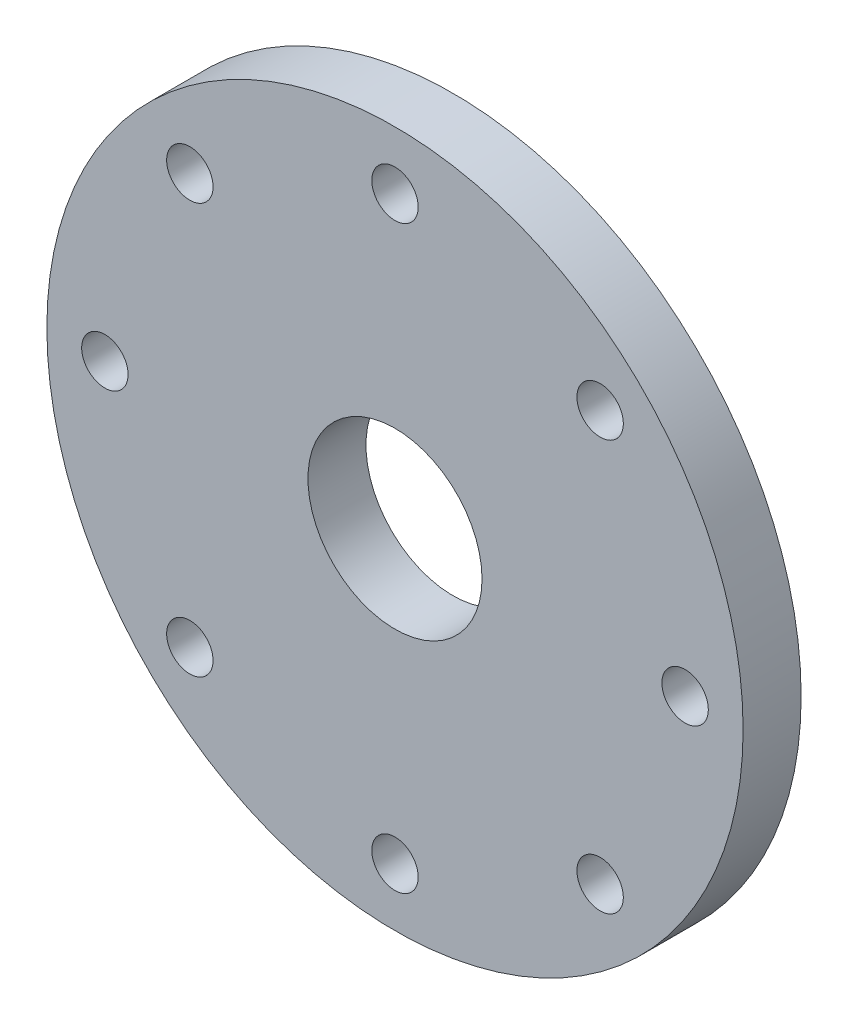
ISO-10303-21;
HEADER;
FILE_DESCRIPTION(('STEP AP214'),'2;1');
FILE_NAME('part.step','',(''),(''),'','','');
FILE_SCHEMA(('AUTOMOTIVE_DESIGN { 1 0 10303 214 1 1 1 1 }'));
ENDSEC;
DATA;
#1=APPLICATION_CONTEXT('core data for automotive mechanical design processes');
#2=APPLICATION_PROTOCOL_DEFINITION('international standard','automotive_design',2000,#1);
#3=PRODUCT_CONTEXT('',#1,'mechanical');
#4=PRODUCT('Part','Part','',(#3));
#5=PRODUCT_RELATED_PRODUCT_CATEGORY('part','',(#4));
#6=PRODUCT_DEFINITION_FORMATION('','',#4);
#7=PRODUCT_DEFINITION_CONTEXT('part definition',#1,'design');
#8=PRODUCT_DEFINITION('design','',#6,#7);
#9=PRODUCT_DEFINITION_SHAPE('','',#8);
#10=(LENGTH_UNIT() NAMED_UNIT(*) SI_UNIT(.MILLI.,.METRE.));
#11=(NAMED_UNIT(*) PLANE_ANGLE_UNIT() SI_UNIT($,.RADIAN.));
#12=(NAMED_UNIT(*) SI_UNIT($,.STERADIAN.) SOLID_ANGLE_UNIT());
#13=UNCERTAINTY_MEASURE_WITH_UNIT(LENGTH_MEASURE(1.E-05),#10,'distance_accuracy_value','');
#14=(GEOMETRIC_REPRESENTATION_CONTEXT(3) GLOBAL_UNCERTAINTY_ASSIGNED_CONTEXT((#13)) GLOBAL_UNIT_ASSIGNED_CONTEXT((#10,
#11,#12)) REPRESENTATION_CONTEXT('',''));
#15=CARTESIAN_POINT('',(0.,0.,0.));
#16=DIRECTION('',(0.,0.,1.));
#17=DIRECTION('',(1.,0.,0.));
#18=AXIS2_PLACEMENT_3D('',#15,#16,#17);
#19=CARTESIAN_POINT('',(0.,0.,3.175));
#20=DIRECTION('',(0.,0.,1.));
#21=DIRECTION('',(1.,0.,0.));
#22=AXIS2_PLACEMENT_3D('',#19,#20,#21);
#23=PLANE('',#22);
#24=CARTESIAN_POINT('',(-15.875,1.66281895072834E-13,3.175));
#25=DIRECTION('',(0.,0.,1.));
#26=DIRECTION('',(1.,0.,0.));
#27=AXIS2_PLACEMENT_3D('',#24,#25,#26);
#28=CIRCLE('',#27,1.27);
#29=CARTESIAN_POINT('',(-14.605,1.66281895072834E-13,3.175));
#30=VERTEX_POINT('',#29);
#31=EDGE_CURVE('E81',#30,#30,#28,.T.);
#32=ORIENTED_EDGE('',*,*,#31,.F.);
#33=EDGE_LOOP('',(#32));
#34=FACE_BOUND('',#33,.T.);
#35=CARTESIAN_POINT('',(-1.10854596715223E-13,-15.875,3.175));
#36=DIRECTION('',(0.,0.,1.));
#37=DIRECTION('',(1.,0.,0.));
#38=AXIS2_PLACEMENT_3D('',#35,#36,#37);
#39=CIRCLE('',#38,1.27);
#40=CARTESIAN_POINT('',(1.26999999999989,-15.875,3.175));
#41=VERTEX_POINT('',#40);
#42=EDGE_CURVE('E69',#41,#41,#39,.T.);
#43=ORIENTED_EDGE('',*,*,#42,.F.);
#44=EDGE_LOOP('',(#43));
#45=FACE_BOUND('',#44,.T.);
#46=CARTESIAN_POINT('',(15.875,0.,3.175));
#47=DIRECTION('',(0.,0.,1.));
#48=DIRECTION('',(1.,0.,0.));
#49=AXIS2_PLACEMENT_3D('',#46,#47,#48);
#50=CIRCLE('',#49,1.27);
#51=CARTESIAN_POINT('',(17.145,0.,3.175));
#52=VERTEX_POINT('',#51);
#53=EDGE_CURVE('E57',#52,#52,#50,.T.);
#54=ORIENTED_EDGE('',*,*,#53,.F.);
#55=EDGE_LOOP('',(#54));
#56=FACE_BOUND('',#55,.T.);
#57=CARTESIAN_POINT('',(11.2253201513365,11.2253201513364,3.175));
#58=DIRECTION('',(0.,0.,1.));
#59=DIRECTION('',(1.,0.,0.));
#60=AXIS2_PLACEMENT_3D('',#57,#58,#59);
#61=CIRCLE('',#60,1.27);
#62=CARTESIAN_POINT('',(12.4953201513365,11.2253201513364,3.175));
#63=VERTEX_POINT('',#62);
#64=EDGE_CURVE('E45',#63,#63,#61,.T.);
#65=ORIENTED_EDGE('',*,*,#64,.F.);
#66=EDGE_LOOP('',(#65));
#67=FACE_BOUND('',#66,.T.);
#68=CARTESIAN_POINT('',(0.,0.,3.175));
#69=DIRECTION('',(0.,0.,1.));
#70=DIRECTION('',(1.,0.,0.));
#71=AXIS2_PLACEMENT_3D('',#68,#69,#70);
#72=CIRCLE('',#71,19.05);
#73=CARTESIAN_POINT('',(19.05,0.,3.175));
#74=VERTEX_POINT('',#73);
#75=EDGE_CURVE('E10',#74,#74,#72,.T.);
#76=ORIENTED_EDGE('',*,*,#75,.T.);
#77=EDGE_LOOP('',(#76));
#78=FACE_BOUND('',#77,.T.);
#79=CARTESIAN_POINT('',(0.,15.875,3.175));
#80=DIRECTION('',(0.,0.,1.));
#81=DIRECTION('',(1.,0.,0.));
#82=AXIS2_PLACEMENT_3D('',#79,#80,#81);
#83=CIRCLE('',#82,1.27);
#84=CARTESIAN_POINT('',(1.27,15.875,3.175));
#85=VERTEX_POINT('',#84);
#86=EDGE_CURVE('E40',#85,#85,#83,.T.);
#87=ORIENTED_EDGE('',*,*,#86,.F.);
#88=EDGE_LOOP('',(#87));
#89=FACE_BOUND('',#88,.T.);
#90=CARTESIAN_POINT('',(0.,0.,3.175));
#91=DIRECTION('',(0.,0.,1.));
#92=DIRECTION('',(1.,0.,0.));
#93=AXIS2_PLACEMENT_3D('',#90,#91,#92);
#94=CIRCLE('',#93,4.7625);
#95=CARTESIAN_POINT('',(4.7625,0.,3.175));
#96=VERTEX_POINT('',#95);
#97=EDGE_CURVE('E51',#96,#96,#94,.T.);
#98=ORIENTED_EDGE('',*,*,#97,.F.);
#99=EDGE_LOOP('',(#98));
#100=FACE_BOUND('',#99,.T.);
#101=CARTESIAN_POINT('',(11.2253201513364,-11.2253201513365,3.175));
#102=DIRECTION('',(0.,0.,1.));
#103=DIRECTION('',(1.,0.,0.));
#104=AXIS2_PLACEMENT_3D('',#101,#102,#103);
#105=CIRCLE('',#104,1.27);
#106=CARTESIAN_POINT('',(12.4953201513364,-11.2253201513365,3.175));
#107=VERTEX_POINT('',#106);
#108=EDGE_CURVE('E63',#107,#107,#105,.T.);
#109=ORIENTED_EDGE('',*,*,#108,.F.);
#110=EDGE_LOOP('',(#109));
#111=FACE_BOUND('',#110,.T.);
#112=CARTESIAN_POINT('',(-11.2253201513365,-11.2253201513363,3.175));
#113=DIRECTION('',(0.,0.,1.));
#114=DIRECTION('',(1.,0.,0.));
#115=AXIS2_PLACEMENT_3D('',#112,#113,#114);
#116=CIRCLE('',#115,1.27);
#117=CARTESIAN_POINT('',(-9.95532015133654,-11.2253201513363,3.175));
#118=VERTEX_POINT('',#117);
#119=EDGE_CURVE('E75',#118,#118,#116,.T.);
#120=ORIENTED_EDGE('',*,*,#119,.F.);
#121=EDGE_LOOP('',(#120));
#122=FACE_BOUND('',#121,.T.);
#123=CARTESIAN_POINT('',(-11.2253201513363,11.2253201513366,3.175));
#124=DIRECTION('',(0.,0.,1.));
#125=DIRECTION('',(1.,0.,0.));
#126=AXIS2_PLACEMENT_3D('',#123,#124,#125);
#127=CIRCLE('',#126,1.27);
#128=CARTESIAN_POINT('',(-9.95532015133631,11.2253201513366,3.175));
#129=VERTEX_POINT('',#128);
#130=EDGE_CURVE('E87',#129,#129,#127,.T.);
#131=ORIENTED_EDGE('',*,*,#130,.F.);
#132=EDGE_LOOP('',(#131));
#133=FACE_BOUND('',#132,.T.);
#134=ADVANCED_FACE('F29',(#34,#45,#56,#67,#78,#89,#100,#111,#122,#133),#23,.T.);
#135=CARTESIAN_POINT('',(0.,0.,0.));
#136=DIRECTION('',(0.,0.,1.));
#137=DIRECTION('',(1.,0.,0.));
#138=AXIS2_PLACEMENT_3D('',#135,#136,#137);
#139=PLANE('',#138);
#140=CARTESIAN_POINT('',(-15.875,1.66281895072834E-13,0.));
#141=DIRECTION('',(0.,0.,1.));
#142=DIRECTION('',(1.,0.,0.));
#143=AXIS2_PLACEMENT_3D('',#140,#141,#142);
#144=CIRCLE('',#143,1.27);
#145=CARTESIAN_POINT('',(-14.605,1.66281895072834E-13,0.));
#146=VERTEX_POINT('',#145);
#147=EDGE_CURVE('E84',#146,#146,#144,.T.);
#148=ORIENTED_EDGE('',*,*,#147,.T.);
#149=EDGE_LOOP('',(#148));
#150=FACE_BOUND('',#149,.T.);
#151=CARTESIAN_POINT('',(-1.10854596715223E-13,-15.875,0.));
#152=DIRECTION('',(0.,0.,1.));
#153=DIRECTION('',(1.,0.,0.));
#154=AXIS2_PLACEMENT_3D('',#151,#152,#153);
#155=CIRCLE('',#154,1.27);
#156=CARTESIAN_POINT('',(1.26999999999989,-15.875,0.));
#157=VERTEX_POINT('',#156);
#158=EDGE_CURVE('E72',#157,#157,#155,.T.);
#159=ORIENTED_EDGE('',*,*,#158,.T.);
#160=EDGE_LOOP('',(#159));
#161=FACE_BOUND('',#160,.T.);
#162=CARTESIAN_POINT('',(15.875,0.,0.));
#163=DIRECTION('',(0.,0.,1.));
#164=DIRECTION('',(1.,0.,0.));
#165=AXIS2_PLACEMENT_3D('',#162,#163,#164);
#166=CIRCLE('',#165,1.27);
#167=CARTESIAN_POINT('',(17.145,0.,0.));
#168=VERTEX_POINT('',#167);
#169=EDGE_CURVE('E60',#168,#168,#166,.T.);
#170=ORIENTED_EDGE('',*,*,#169,.T.);
#171=EDGE_LOOP('',(#170));
#172=FACE_BOUND('',#171,.T.);
#173=CARTESIAN_POINT('',(11.2253201513365,11.2253201513364,0.));
#174=DIRECTION('',(0.,0.,1.));
#175=DIRECTION('',(1.,0.,0.));
#176=AXIS2_PLACEMENT_3D('',#173,#174,#175);
#177=CIRCLE('',#176,1.27);
#178=CARTESIAN_POINT('',(12.4953201513365,11.2253201513364,0.));
#179=VERTEX_POINT('',#178);
#180=EDGE_CURVE('E48',#179,#179,#177,.T.);
#181=ORIENTED_EDGE('',*,*,#180,.T.);
#182=EDGE_LOOP('',(#181));
#183=FACE_BOUND('',#182,.T.);
#184=CARTESIAN_POINT('',(0.,0.,0.));
#185=DIRECTION('',(0.,0.,1.));
#186=DIRECTION('',(1.,0.,0.));
#187=AXIS2_PLACEMENT_3D('',#184,#185,#186);
#188=CIRCLE('',#187,19.05);
#189=CARTESIAN_POINT('',(19.05,0.,0.));
#190=VERTEX_POINT('',#189);
#191=EDGE_CURVE('E33',#190,#190,#188,.T.);
#192=ORIENTED_EDGE('',*,*,#191,.F.);
#193=EDGE_LOOP('',(#192));
#194=FACE_BOUND('',#193,.T.);
#195=CARTESIAN_POINT('',(0.,15.875,0.));
#196=DIRECTION('',(0.,0.,1.));
#197=DIRECTION('',(1.,0.,0.));
#198=AXIS2_PLACEMENT_3D('',#195,#196,#197);
#199=CIRCLE('',#198,1.27);
#200=CARTESIAN_POINT('',(1.27,15.875,0.));
#201=VERTEX_POINT('',#200);
#202=EDGE_CURVE('E42',#201,#201,#199,.T.);
#203=ORIENTED_EDGE('',*,*,#202,.T.);
#204=EDGE_LOOP('',(#203));
#205=FACE_BOUND('',#204,.T.);
#206=CARTESIAN_POINT('',(0.,0.,0.));
#207=DIRECTION('',(0.,0.,1.));
#208=DIRECTION('',(1.,0.,0.));
#209=AXIS2_PLACEMENT_3D('',#206,#207,#208);
#210=CIRCLE('',#209,4.7625);
#211=CARTESIAN_POINT('',(4.7625,0.,0.));
#212=VERTEX_POINT('',#211);
#213=EDGE_CURVE('E54',#212,#212,#210,.T.);
#214=ORIENTED_EDGE('',*,*,#213,.T.);
#215=EDGE_LOOP('',(#214));
#216=FACE_BOUND('',#215,.T.);
#217=CARTESIAN_POINT('',(11.2253201513364,-11.2253201513365,0.));
#218=DIRECTION('',(0.,0.,1.));
#219=DIRECTION('',(1.,0.,0.));
#220=AXIS2_PLACEMENT_3D('',#217,#218,#219);
#221=CIRCLE('',#220,1.27);
#222=CARTESIAN_POINT('',(12.4953201513364,-11.2253201513365,0.));
#223=VERTEX_POINT('',#222);
#224=EDGE_CURVE('E66',#223,#223,#221,.T.);
#225=ORIENTED_EDGE('',*,*,#224,.T.);
#226=EDGE_LOOP('',(#225));
#227=FACE_BOUND('',#226,.T.);
#228=CARTESIAN_POINT('',(-11.2253201513365,-11.2253201513363,0.));
#229=DIRECTION('',(0.,0.,1.));
#230=DIRECTION('',(1.,0.,0.));
#231=AXIS2_PLACEMENT_3D('',#228,#229,#230);
#232=CIRCLE('',#231,1.27);
#233=CARTESIAN_POINT('',(-9.95532015133654,-11.2253201513363,0.));
#234=VERTEX_POINT('',#233);
#235=EDGE_CURVE('E78',#234,#234,#232,.T.);
#236=ORIENTED_EDGE('',*,*,#235,.T.);
#237=EDGE_LOOP('',(#236));
#238=FACE_BOUND('',#237,.T.);
#239=CARTESIAN_POINT('',(-11.2253201513363,11.2253201513366,0.));
#240=DIRECTION('',(0.,0.,1.));
#241=DIRECTION('',(1.,0.,0.));
#242=AXIS2_PLACEMENT_3D('',#239,#240,#241);
#243=CIRCLE('',#242,1.27);
#244=CARTESIAN_POINT('',(-9.95532015133631,11.2253201513366,0.));
#245=VERTEX_POINT('',#244);
#246=EDGE_CURVE('E90',#245,#245,#243,.T.);
#247=ORIENTED_EDGE('',*,*,#246,.T.);
#248=EDGE_LOOP('',(#247));
#249=FACE_BOUND('',#248,.T.);
#250=ADVANCED_FACE('F100',(#150,#161,#172,#183,#194,#205,#216,#227,#238,#249),#139,.F.);
#251=CARTESIAN_POINT('',(0.,0.,3.175));
#252=DIRECTION('',(0.,0.,-1.));
#253=DIRECTION('',(-1.,0.,0.));
#254=AXIS2_PLACEMENT_3D('',#251,#252,#253);
#255=CYLINDRICAL_SURFACE('',#254,19.05);
#256=ORIENTED_EDGE('',*,*,#75,.F.);
#257=EDGE_LOOP('',(#256));
#258=FACE_BOUND('',#257,.T.);
#259=ORIENTED_EDGE('',*,*,#191,.T.);
#260=EDGE_LOOP('',(#259));
#261=FACE_BOUND('',#260,.T.);
#262=ADVANCED_FACE('F31',(#258,#261),#255,.T.);
#263=CARTESIAN_POINT('',(0.,15.875,3.175));
#264=DIRECTION('',(0.,0.,-1.));
#265=DIRECTION('',(-1.,0.,0.));
#266=AXIS2_PLACEMENT_3D('',#263,#264,#265);
#267=CYLINDRICAL_SURFACE('',#266,1.27);
#268=ORIENTED_EDGE('',*,*,#86,.T.);
#269=EDGE_LOOP('',(#268));
#270=FACE_BOUND('',#269,.T.);
#271=ORIENTED_EDGE('',*,*,#202,.F.);
#272=EDGE_LOOP('',(#271));
#273=FACE_BOUND('',#272,.T.);
#274=ADVANCED_FACE('F110',(#270,#273),#267,.F.);
#275=CARTESIAN_POINT('',(11.2253201513365,11.2253201513364,3.175));
#276=DIRECTION('',(0.,0.,-1.));
#277=DIRECTION('',(-1.,0.,0.));
#278=AXIS2_PLACEMENT_3D('',#275,#276,#277);
#279=CYLINDRICAL_SURFACE('',#278,1.27);
#280=ORIENTED_EDGE('',*,*,#64,.T.);
#281=EDGE_LOOP('',(#280));
#282=FACE_BOUND('',#281,.T.);
#283=ORIENTED_EDGE('',*,*,#180,.F.);
#284=EDGE_LOOP('',(#283));
#285=FACE_BOUND('',#284,.T.);
#286=ADVANCED_FACE('F113',(#282,#285),#279,.F.);
#287=CARTESIAN_POINT('',(0.,0.,3.175));
#288=DIRECTION('',(0.,0.,-1.));
#289=DIRECTION('',(-1.,0.,0.));
#290=AXIS2_PLACEMENT_3D('',#287,#288,#289);
#291=CYLINDRICAL_SURFACE('',#290,4.7625);
#292=ORIENTED_EDGE('',*,*,#97,.T.);
#293=EDGE_LOOP('',(#292));
#294=FACE_BOUND('',#293,.T.);
#295=ORIENTED_EDGE('',*,*,#213,.F.);
#296=EDGE_LOOP('',(#295));
#297=FACE_BOUND('',#296,.T.);
#298=ADVANCED_FACE('F117',(#294,#297),#291,.F.);
#299=CARTESIAN_POINT('',(15.875,0.,3.175));
#300=DIRECTION('',(0.,0.,-1.));
#301=DIRECTION('',(-1.,0.,0.));
#302=AXIS2_PLACEMENT_3D('',#299,#300,#301);
#303=CYLINDRICAL_SURFACE('',#302,1.27);
#304=ORIENTED_EDGE('',*,*,#53,.T.);
#305=EDGE_LOOP('',(#304));
#306=FACE_BOUND('',#305,.T.);
#307=ORIENTED_EDGE('',*,*,#169,.F.);
#308=EDGE_LOOP('',(#307));
#309=FACE_BOUND('',#308,.T.);
#310=ADVANCED_FACE('F121',(#306,#309),#303,.F.);
#311=CARTESIAN_POINT('',(11.2253201513364,-11.2253201513365,3.175));
#312=DIRECTION('',(0.,0.,-1.));
#313=DIRECTION('',(-1.,0.,0.));
#314=AXIS2_PLACEMENT_3D('',#311,#312,#313);
#315=CYLINDRICAL_SURFACE('',#314,1.27);
#316=ORIENTED_EDGE('',*,*,#108,.T.);
#317=EDGE_LOOP('',(#316));
#318=FACE_BOUND('',#317,.T.);
#319=ORIENTED_EDGE('',*,*,#224,.F.);
#320=EDGE_LOOP('',(#319));
#321=FACE_BOUND('',#320,.T.);
#322=ADVANCED_FACE('F125',(#318,#321),#315,.F.);
#323=CARTESIAN_POINT('',(-1.10854596715223E-13,-15.875,3.175));
#324=DIRECTION('',(0.,0.,-1.));
#325=DIRECTION('',(-1.,0.,0.));
#326=AXIS2_PLACEMENT_3D('',#323,#324,#325);
#327=CYLINDRICAL_SURFACE('',#326,1.27);
#328=ORIENTED_EDGE('',*,*,#42,.T.);
#329=EDGE_LOOP('',(#328));
#330=FACE_BOUND('',#329,.T.);
#331=ORIENTED_EDGE('',*,*,#158,.F.);
#332=EDGE_LOOP('',(#331));
#333=FACE_BOUND('',#332,.T.);
#334=ADVANCED_FACE('F129',(#330,#333),#327,.F.);
#335=CARTESIAN_POINT('',(-11.2253201513365,-11.2253201513363,3.175));
#336=DIRECTION('',(0.,0.,-1.));
#337=DIRECTION('',(-1.,0.,0.));
#338=AXIS2_PLACEMENT_3D('',#335,#336,#337);
#339=CYLINDRICAL_SURFACE('',#338,1.27);
#340=ORIENTED_EDGE('',*,*,#119,.T.);
#341=EDGE_LOOP('',(#340));
#342=FACE_BOUND('',#341,.T.);
#343=ORIENTED_EDGE('',*,*,#235,.F.);
#344=EDGE_LOOP('',(#343));
#345=FACE_BOUND('',#344,.T.);
#346=ADVANCED_FACE('F133',(#342,#345),#339,.F.);
#347=CARTESIAN_POINT('',(-15.875,1.66281895072834E-13,3.175));
#348=DIRECTION('',(0.,0.,-1.));
#349=DIRECTION('',(-1.,0.,0.));
#350=AXIS2_PLACEMENT_3D('',#347,#348,#349);
#351=CYLINDRICAL_SURFACE('',#350,1.27);
#352=ORIENTED_EDGE('',*,*,#31,.T.);
#353=EDGE_LOOP('',(#352));
#354=FACE_BOUND('',#353,.T.);
#355=ORIENTED_EDGE('',*,*,#147,.F.);
#356=EDGE_LOOP('',(#355));
#357=FACE_BOUND('',#356,.T.);
#358=ADVANCED_FACE('F137',(#354,#357),#351,.F.);
#359=CARTESIAN_POINT('',(-11.2253201513363,11.2253201513366,3.175));
#360=DIRECTION('',(0.,0.,-1.));
#361=DIRECTION('',(-1.,0.,0.));
#362=AXIS2_PLACEMENT_3D('',#359,#360,#361);
#363=CYLINDRICAL_SURFACE('',#362,1.27);
#364=ORIENTED_EDGE('',*,*,#130,.T.);
#365=EDGE_LOOP('',(#364));
#366=FACE_BOUND('',#365,.T.);
#367=ORIENTED_EDGE('',*,*,#246,.F.);
#368=EDGE_LOOP('',(#367));
#369=FACE_BOUND('',#368,.T.);
#370=ADVANCED_FACE('F96',(#366,#369),#363,.F.);
#371=CLOSED_SHELL('',(#134,#250,#262,#274,#286,#298,#310,#322,#334,#346,#358,#370));
#372=MANIFOLD_SOLID_BREP('B2',#371);
#373=ADVANCED_BREP_SHAPE_REPRESENTATION('',(#18,#372),#14);
#374=SHAPE_DEFINITION_REPRESENTATION(#9,#373);
ENDSEC;
END-ISO-10303-21;
